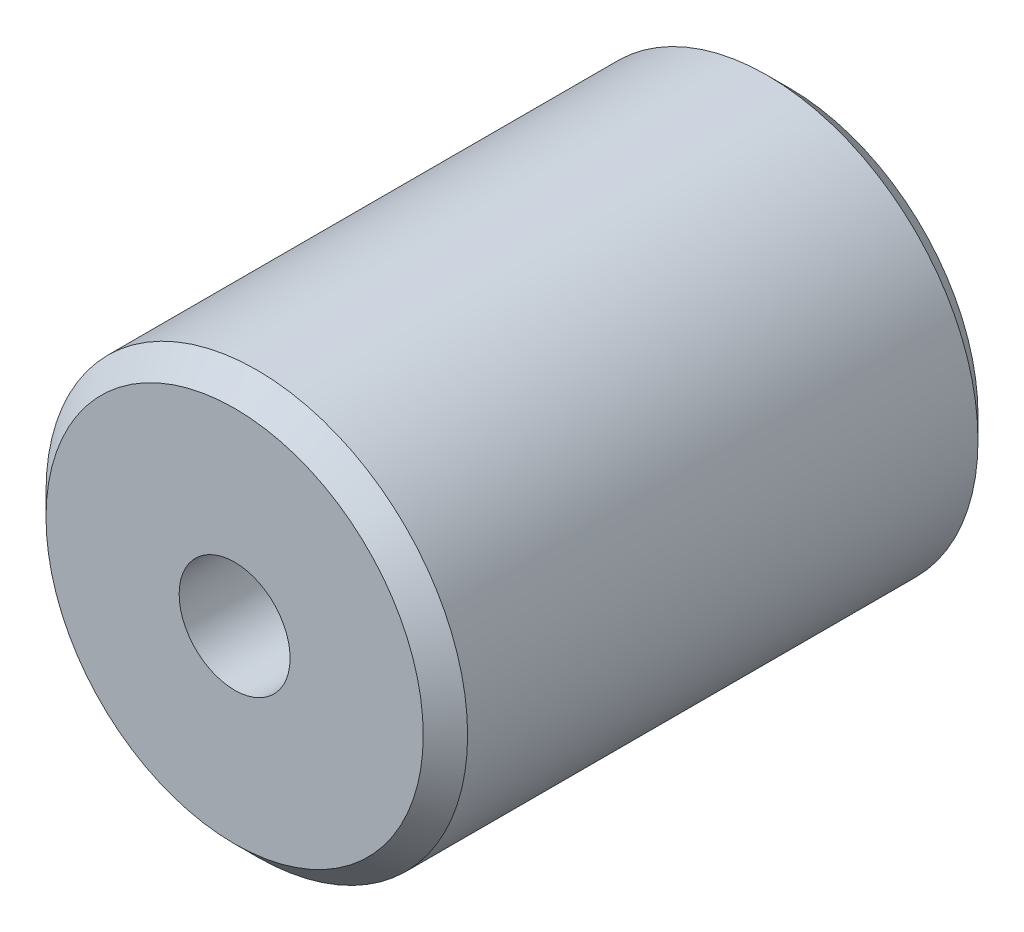
ISO-10303-21;
HEADER;
FILE_DESCRIPTION(('STEP AP214'),'2;1');
FILE_NAME('part.step','',(''),(''),'','','');
FILE_SCHEMA(('AUTOMOTIVE_DESIGN { 1 0 10303 214 1 1 1 1 }'));
ENDSEC;
DATA;
#1=APPLICATION_CONTEXT('core data for automotive mechanical design processes');
#2=APPLICATION_PROTOCOL_DEFINITION('international standard','automotive_design',2000,#1);
#3=PRODUCT_CONTEXT('',#1,'mechanical');
#4=PRODUCT('Part','Part','',(#3));
#5=PRODUCT_RELATED_PRODUCT_CATEGORY('part','',(#4));
#6=PRODUCT_DEFINITION_FORMATION('','',#4);
#7=PRODUCT_DEFINITION_CONTEXT('part definition',#1,'design');
#8=PRODUCT_DEFINITION('design','',#6,#7);
#9=PRODUCT_DEFINITION_SHAPE('','',#8);
#10=(LENGTH_UNIT() NAMED_UNIT(*) SI_UNIT(.MILLI.,.METRE.));
#11=(NAMED_UNIT(*) PLANE_ANGLE_UNIT() SI_UNIT($,.RADIAN.));
#12=(NAMED_UNIT(*) SI_UNIT($,.STERADIAN.) SOLID_ANGLE_UNIT());
#13=UNCERTAINTY_MEASURE_WITH_UNIT(LENGTH_MEASURE(1.E-05),#10,'distance_accuracy_value','');
#14=(GEOMETRIC_REPRESENTATION_CONTEXT(3) GLOBAL_UNCERTAINTY_ASSIGNED_CONTEXT((#13)) GLOBAL_UNIT_ASSIGNED_CONTEXT((#10,
#11,#12)) REPRESENTATION_CONTEXT('',''));
#15=CARTESIAN_POINT('',(0.,0.,0.));
#16=DIRECTION('',(0.,0.,1.));
#17=DIRECTION('',(1.,0.,0.));
#18=AXIS2_PLACEMENT_3D('',#15,#16,#17);
#19=CARTESIAN_POINT('',(0.,0.,25.));
#20=DIRECTION('',(0.,0.,-1.));
#21=DIRECTION('',(-1.,0.,0.));
#22=AXIS2_PLACEMENT_3D('',#19,#20,#21);
#23=CYLINDRICAL_SURFACE('',#22,2.5);
#24=CARTESIAN_POINT('',(0.,0.,25.));
#25=DIRECTION('',(0.,0.,1.));
#26=DIRECTION('',(1.,0.,0.));
#27=AXIS2_PLACEMENT_3D('',#24,#25,#26);
#28=CIRCLE('',#27,2.5);
#29=CARTESIAN_POINT('',(2.5,0.,25.));
#30=VERTEX_POINT('',#29);
#31=EDGE_CURVE('E61',#30,#30,#28,.T.);
#32=ORIENTED_EDGE('',*,*,#31,.T.);
#33=EDGE_LOOP('',(#32));
#34=FACE_BOUND('',#33,.T.);
#35=CARTESIAN_POINT('',(0.,0.,18.));
#36=DIRECTION('',(0.,0.,-1.));
#37=DIRECTION('',(-1.,0.,0.));
#38=AXIS2_PLACEMENT_3D('',#35,#36,#37);
#39=CIRCLE('',#38,2.5);
#40=CARTESIAN_POINT('',(-2.5,0.,18.));
#41=VERTEX_POINT('',#40);
#42=EDGE_CURVE('E45',#41,#41,#39,.T.);
#43=ORIENTED_EDGE('',*,*,#42,.T.);
#44=EDGE_LOOP('',(#43));
#45=FACE_BOUND('',#44,.T.);
#46=ADVANCED_FACE('F40',(#34,#45),#23,.F.);
#47=CARTESIAN_POINT('',(0.,0.,25.));
#48=DIRECTION('',(0.,0.,1.));
#49=DIRECTION('',(1.,0.,0.));
#50=AXIS2_PLACEMENT_3D('',#47,#48,#49);
#51=PLANE('',#50);
#52=CARTESIAN_POINT('',(0.,0.,25.));
#53=DIRECTION('',(0.,0.,1.));
#54=DIRECTION('',(1.,0.,0.));
#55=AXIS2_PLACEMENT_3D('',#52,#53,#54);
#56=CIRCLE('',#55,8.5);
#57=CARTESIAN_POINT('',(8.5,0.,25.));
#58=VERTEX_POINT('',#57);
#59=EDGE_CURVE('E10',#58,#58,#56,.T.);
#60=ORIENTED_EDGE('',*,*,#59,.T.);
#61=EDGE_LOOP('',(#60));
#62=FACE_BOUND('',#61,.T.);
#63=ORIENTED_EDGE('',*,*,#31,.F.);
#64=EDGE_LOOP('',(#63));
#65=FACE_BOUND('',#64,.T.);
#66=ADVANCED_FACE('F85',(#62,#65),#51,.T.);
#67=CARTESIAN_POINT('',(0.,0.,0.));
#68=DIRECTION('',(0.,0.,1.));
#69=DIRECTION('',(1.,0.,0.));
#70=AXIS2_PLACEMENT_3D('',#67,#68,#69);
#71=PLANE('',#70);
#72=CARTESIAN_POINT('',(0.,0.,0.));
#73=DIRECTION('',(0.,0.,-1.));
#74=DIRECTION('',(-1.,0.,0.));
#75=AXIS2_PLACEMENT_3D('',#72,#73,#74);
#76=CIRCLE('',#75,4.);
#77=CARTESIAN_POINT('',(-4.,0.,0.));
#78=VERTEX_POINT('',#77);
#79=EDGE_CURVE('E64',#78,#78,#76,.T.);
#80=ORIENTED_EDGE('',*,*,#79,.F.);
#81=EDGE_LOOP('',(#80));
#82=FACE_BOUND('',#81,.T.);
#83=CARTESIAN_POINT('',(0.,0.,0.));
#84=DIRECTION('',(0.,0.,1.));
#85=DIRECTION('',(1.,0.,0.));
#86=AXIS2_PLACEMENT_3D('',#83,#84,#85);
#87=CIRCLE('',#86,8.49999999999999);
#88=CARTESIAN_POINT('',(8.49999999999999,0.,0.));
#89=VERTEX_POINT('',#88);
#90=EDGE_CURVE('E49',#89,#89,#87,.F.);
#91=ORIENTED_EDGE('',*,*,#90,.T.);
#92=EDGE_LOOP('',(#91));
#93=FACE_BOUND('',#92,.T.);
#94=ADVANCED_FACE('F91',(#82,#93),#71,.F.);
#95=CARTESIAN_POINT('',(0.,0.,25.));
#96=DIRECTION('',(0.,0.,-1.));
#97=DIRECTION('',(-1.,0.,0.));
#98=AXIS2_PLACEMENT_3D('',#95,#96,#97);
#99=CYLINDRICAL_SURFACE('',#98,9.5);
#100=CARTESIAN_POINT('',(0.,0.,1.00000000000001));
#101=DIRECTION('',(0.,0.,1.));
#102=DIRECTION('',(1.,0.,0.));
#103=AXIS2_PLACEMENT_3D('',#100,#101,#102);
#104=CIRCLE('',#103,9.5);
#105=CARTESIAN_POINT('',(9.5,0.,1.00000000000001));
#106=VERTEX_POINT('',#105);
#107=EDGE_CURVE('E53',#106,#106,#104,.T.);
#108=ORIENTED_EDGE('',*,*,#107,.T.);
#109=EDGE_LOOP('',(#108));
#110=FACE_BOUND('',#109,.T.);
#111=CARTESIAN_POINT('',(0.,0.,24.));
#112=DIRECTION('',(0.,0.,1.));
#113=DIRECTION('',(1.,0.,0.));
#114=AXIS2_PLACEMENT_3D('',#111,#112,#113);
#115=CIRCLE('',#114,9.5);
#116=CARTESIAN_POINT('',(9.5,0.,24.));
#117=VERTEX_POINT('',#116);
#118=EDGE_CURVE('E58',#117,#117,#115,.F.);
#119=ORIENTED_EDGE('',*,*,#118,.T.);
#120=EDGE_LOOP('',(#119));
#121=FACE_BOUND('',#120,.T.);
#122=ADVANCED_FACE('F96',(#110,#121),#99,.T.);
#123=CARTESIAN_POINT('',(0.,0.,1.00000000000001));
#124=DIRECTION('',(0.,0.,1.));
#125=DIRECTION('',(1.,0.,0.));
#126=AXIS2_PLACEMENT_3D('',#123,#124,#125);
#127=CONICAL_SURFACE('',#126,9.5,0.78539816339745);
#128=ORIENTED_EDGE('',*,*,#90,.F.);
#129=EDGE_LOOP('',(#128));
#130=FACE_BOUND('',#129,.T.);
#131=ORIENTED_EDGE('',*,*,#107,.F.);
#132=EDGE_LOOP('',(#131));
#133=FACE_BOUND('',#132,.T.);
#134=ADVANCED_FACE('F99',(#130,#133),#127,.T.);
#135=CARTESIAN_POINT('',(0.,0.,25.));
#136=DIRECTION('',(0.,0.,-1.));
#137=DIRECTION('',(-1.,0.,0.));
#138=AXIS2_PLACEMENT_3D('',#135,#136,#137);
#139=CONICAL_SURFACE('',#138,8.5,0.785398163397448);
#140=ORIENTED_EDGE('',*,*,#118,.F.);
#141=EDGE_LOOP('',(#140));
#142=FACE_BOUND('',#141,.T.);
#143=ORIENTED_EDGE('',*,*,#59,.F.);
#144=EDGE_LOOP('',(#143));
#145=FACE_BOUND('',#144,.T.);
#146=ADVANCED_FACE('F43',(#142,#145),#139,.T.);
#147=CARTESIAN_POINT('',(0.,0.,18.));
#148=DIRECTION('',(0.,0.,-1.));
#149=DIRECTION('',(-1.,0.,0.));
#150=AXIS2_PLACEMENT_3D('',#147,#148,#149);
#151=CYLINDRICAL_SURFACE('',#150,4.);
#152=CARTESIAN_POINT('',(0.,0.,18.));
#153=DIRECTION('',(0.,0.,-1.));
#154=DIRECTION('',(-1.,0.,0.));
#155=AXIS2_PLACEMENT_3D('',#152,#153,#154);
#156=CIRCLE('',#155,4.);
#157=CARTESIAN_POINT('',(-4.,0.,18.));
#158=VERTEX_POINT('',#157);
#159=EDGE_CURVE('E67',#158,#158,#156,.T.);
#160=ORIENTED_EDGE('',*,*,#159,.F.);
#161=EDGE_LOOP('',(#160));
#162=FACE_BOUND('',#161,.T.);
#163=ORIENTED_EDGE('',*,*,#79,.T.);
#164=EDGE_LOOP('',(#163));
#165=FACE_BOUND('',#164,.T.);
#166=ADVANCED_FACE('F77',(#162,#165),#151,.F.);
#167=CARTESIAN_POINT('',(0.,0.,18.));
#168=DIRECTION('',(0.,0.,-1.));
#169=DIRECTION('',(-1.,0.,0.));
#170=AXIS2_PLACEMENT_3D('',#167,#168,#169);
#171=PLANE('',#170);
#172=ORIENTED_EDGE('',*,*,#42,.F.);
#173=EDGE_LOOP('',(#172));
#174=FACE_BOUND('',#173,.T.);
#175=ORIENTED_EDGE('',*,*,#159,.T.);
#176=EDGE_LOOP('',(#175));
#177=FACE_BOUND('',#176,.T.);
#178=ADVANCED_FACE('F75',(#174,#177),#171,.T.);
#179=CLOSED_SHELL('',(#46,#66,#94,#122,#134,#146,#166,#178));
#180=MANIFOLD_SOLID_BREP('B2',#179);
#181=ADVANCED_BREP_SHAPE_REPRESENTATION('',(#18,#180),#14);
#182=SHAPE_DEFINITION_REPRESENTATION(#9,#181);
ENDSEC;
END-ISO-10303-21;
